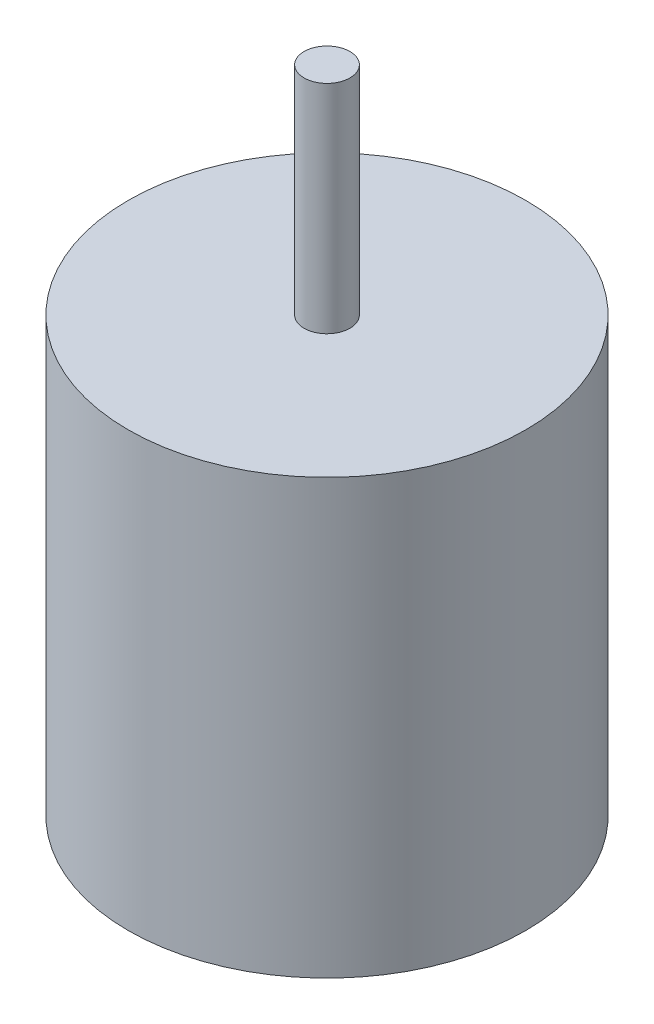
ISO-10303-21;
HEADER;
FILE_DESCRIPTION(('STEP AP214'),'2;1');
FILE_NAME('part.step','',(''),(''),'','','');
FILE_SCHEMA(('AUTOMOTIVE_DESIGN { 1 0 10303 214 1 1 1 1 }'));
ENDSEC;
DATA;
#1=APPLICATION_CONTEXT('core data for automotive mechanical design processes');
#2=APPLICATION_PROTOCOL_DEFINITION('international standard','automotive_design',2000,#1);
#3=PRODUCT_CONTEXT('',#1,'mechanical');
#4=PRODUCT('Part','Part','',(#3));
#5=PRODUCT_RELATED_PRODUCT_CATEGORY('part','',(#4));
#6=PRODUCT_DEFINITION_FORMATION('','',#4);
#7=PRODUCT_DEFINITION_CONTEXT('part definition',#1,'design');
#8=PRODUCT_DEFINITION('design','',#6,#7);
#9=PRODUCT_DEFINITION_SHAPE('','',#8);
#10=(LENGTH_UNIT() NAMED_UNIT(*) SI_UNIT(.MILLI.,.METRE.));
#11=(NAMED_UNIT(*) PLANE_ANGLE_UNIT() SI_UNIT($,.RADIAN.));
#12=(NAMED_UNIT(*) SI_UNIT($,.STERADIAN.) SOLID_ANGLE_UNIT());
#13=UNCERTAINTY_MEASURE_WITH_UNIT(LENGTH_MEASURE(1.E-05),#10,'distance_accuracy_value','');
#14=(GEOMETRIC_REPRESENTATION_CONTEXT(3) GLOBAL_UNCERTAINTY_ASSIGNED_CONTEXT((#13)) GLOBAL_UNIT_ASSIGNED_CONTEXT((#10,
#11,#12)) REPRESENTATION_CONTEXT('',''));
#15=CARTESIAN_POINT('',(0.,0.,0.));
#16=DIRECTION('',(0.,0.,1.));
#17=DIRECTION('',(1.,0.,0.));
#18=AXIS2_PLACEMENT_3D('',#15,#16,#17);
#19=CARTESIAN_POINT('',(0.,30.,0.));
#20=DIRECTION('',(0.,-1.,0.));
#21=DIRECTION('',(0.,0.,-1.));
#22=AXIS2_PLACEMENT_3D('',#19,#20,#21);
#23=CYLINDRICAL_SURFACE('',#22,13.75);
#24=CARTESIAN_POINT('',(0.,30.,0.));
#25=DIRECTION('',(0.,1.,0.));
#26=DIRECTION('',(0.,0.,1.));
#27=AXIS2_PLACEMENT_3D('',#24,#25,#26);
#28=CIRCLE('',#27,13.75);
#29=CARTESIAN_POINT('',(0.,30.,13.75));
#30=VERTEX_POINT('',#29);
#31=EDGE_CURVE('E10',#30,#30,#28,.T.);
#32=ORIENTED_EDGE('',*,*,#31,.F.);
#33=EDGE_LOOP('',(#32));
#34=FACE_BOUND('',#33,.T.);
#35=CARTESIAN_POINT('',(0.,0.,0.));
#36=DIRECTION('',(0.,1.,0.));
#37=DIRECTION('',(0.,0.,1.));
#38=AXIS2_PLACEMENT_3D('',#35,#36,#37);
#39=CIRCLE('',#38,13.75);
#40=CARTESIAN_POINT('',(0.,0.,13.75));
#41=VERTEX_POINT('',#40);
#42=EDGE_CURVE('E46',#41,#41,#39,.T.);
#43=ORIENTED_EDGE('',*,*,#42,.T.);
#44=EDGE_LOOP('',(#43));
#45=FACE_BOUND('',#44,.T.);
#46=ADVANCED_FACE('F43',(#34,#45),#23,.T.);
#47=CARTESIAN_POINT('',(0.,30.,0.));
#48=DIRECTION('',(0.,1.,0.));
#49=DIRECTION('',(0.,0.,1.));
#50=AXIS2_PLACEMENT_3D('',#47,#48,#49);
#51=PLANE('',#50);
#52=CARTESIAN_POINT('',(0.,30.,0.));
#53=DIRECTION('',(0.,1.,0.));
#54=DIRECTION('',(0.,0.,1.));
#55=AXIS2_PLACEMENT_3D('',#52,#53,#54);
#56=CIRCLE('',#55,1.585);
#57=CARTESIAN_POINT('',(0.,30.,1.585));
#58=VERTEX_POINT('',#57);
#59=EDGE_CURVE('E57',#58,#58,#56,.T.);
#60=ORIENTED_EDGE('',*,*,#59,.F.);
#61=EDGE_LOOP('',(#60));
#62=FACE_BOUND('',#61,.T.);
#63=ORIENTED_EDGE('',*,*,#31,.T.);
#64=EDGE_LOOP('',(#63));
#65=FACE_BOUND('',#64,.T.);
#66=ADVANCED_FACE('F74',(#62,#65),#51,.T.);
#67=CARTESIAN_POINT('',(0.,0.,0.));
#68=DIRECTION('',(0.,1.,0.));
#69=DIRECTION('',(0.,0.,1.));
#70=AXIS2_PLACEMENT_3D('',#67,#68,#69);
#71=PLANE('',#70);
#72=ORIENTED_EDGE('',*,*,#42,.F.);
#73=EDGE_LOOP('',(#72));
#74=FACE_BOUND('',#73,.T.);
#75=ADVANCED_FACE('F70',(#74),#71,.F.);
#76=CARTESIAN_POINT('',(0.,45.,0.));
#77=DIRECTION('',(0.,-1.,0.));
#78=DIRECTION('',(0.,0.,-1.));
#79=AXIS2_PLACEMENT_3D('',#76,#77,#78);
#80=CYLINDRICAL_SURFACE('',#79,1.585);
#81=CARTESIAN_POINT('',(0.,45.,0.));
#82=DIRECTION('',(0.,1.,0.));
#83=DIRECTION('',(0.,0.,1.));
#84=AXIS2_PLACEMENT_3D('',#81,#82,#83);
#85=CIRCLE('',#84,1.585);
#86=CARTESIAN_POINT('',(0.,45.,1.585));
#87=VERTEX_POINT('',#86);
#88=EDGE_CURVE('E55',#87,#87,#85,.T.);
#89=ORIENTED_EDGE('',*,*,#88,.F.);
#90=EDGE_LOOP('',(#89));
#91=FACE_BOUND('',#90,.T.);
#92=ORIENTED_EDGE('',*,*,#59,.T.);
#93=EDGE_LOOP('',(#92));
#94=FACE_BOUND('',#93,.T.);
#95=ADVANCED_FACE('F67',(#91,#94),#80,.T.);
#96=CARTESIAN_POINT('',(0.,45.,0.));
#97=DIRECTION('',(0.,1.,0.));
#98=DIRECTION('',(0.,0.,1.));
#99=AXIS2_PLACEMENT_3D('',#96,#97,#98);
#100=PLANE('',#99);
#101=ORIENTED_EDGE('',*,*,#88,.T.);
#102=EDGE_LOOP('',(#101));
#103=FACE_BOUND('',#102,.T.);
#104=ADVANCED_FACE('F65',(#103),#100,.T.);
#105=CLOSED_SHELL('',(#46,#66,#75,#95,#104));
#106=MANIFOLD_SOLID_BREP('B2',#105);
#107=ADVANCED_BREP_SHAPE_REPRESENTATION('',(#18,#106),#14);
#108=SHAPE_DEFINITION_REPRESENTATION(#9,#107);
ENDSEC;
END-ISO-10303-21;
